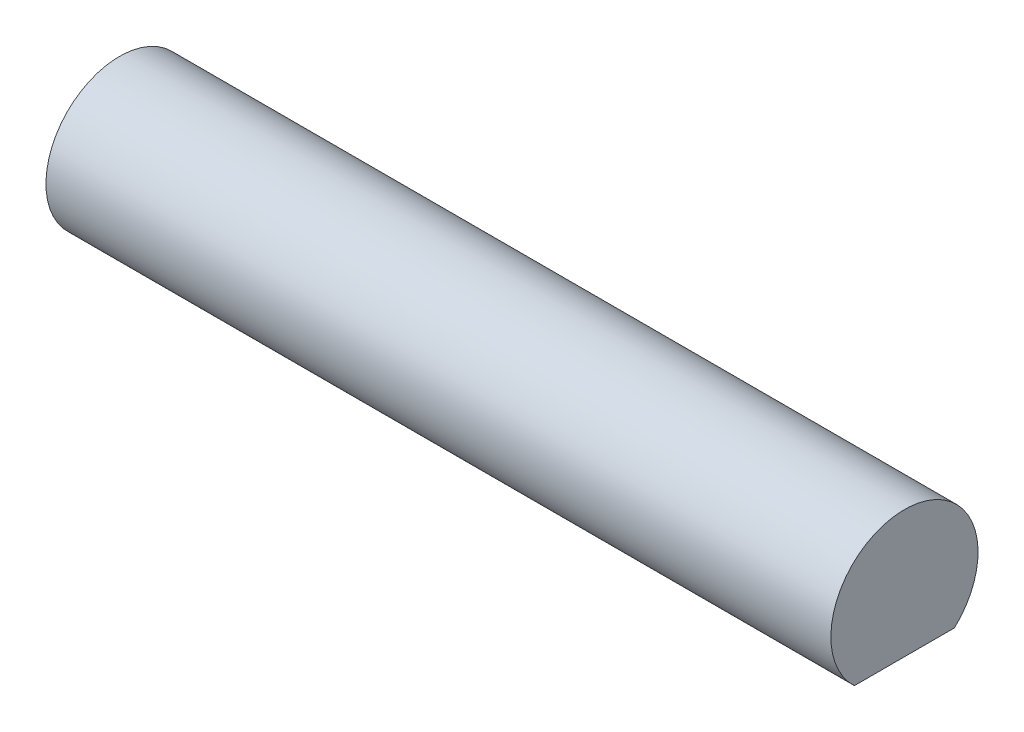
ISO-10303-21;
HEADER;
FILE_DESCRIPTION(('STEP AP214'),'2;1');
FILE_NAME('part.step','',(''),(''),'','','');
FILE_SCHEMA(('AUTOMOTIVE_DESIGN { 1 0 10303 214 1 1 1 1 }'));
ENDSEC;
DATA;
#1=APPLICATION_CONTEXT('core data for automotive mechanical design processes');
#2=APPLICATION_PROTOCOL_DEFINITION('international standard','automotive_design',2000,#1);
#3=PRODUCT_CONTEXT('',#1,'mechanical');
#4=PRODUCT('Part','Part','',(#3));
#5=PRODUCT_RELATED_PRODUCT_CATEGORY('part','',(#4));
#6=PRODUCT_DEFINITION_FORMATION('','',#4);
#7=PRODUCT_DEFINITION_CONTEXT('part definition',#1,'design');
#8=PRODUCT_DEFINITION('design','',#6,#7);
#9=PRODUCT_DEFINITION_SHAPE('','',#8);
#10=(LENGTH_UNIT() NAMED_UNIT(*) SI_UNIT(.MILLI.,.METRE.));
#11=(NAMED_UNIT(*) PLANE_ANGLE_UNIT() SI_UNIT($,.RADIAN.));
#12=(NAMED_UNIT(*) SI_UNIT($,.STERADIAN.) SOLID_ANGLE_UNIT());
#13=UNCERTAINTY_MEASURE_WITH_UNIT(LENGTH_MEASURE(1.E-05),#10,'distance_accuracy_value','');
#14=(GEOMETRIC_REPRESENTATION_CONTEXT(3) GLOBAL_UNCERTAINTY_ASSIGNED_CONTEXT((#13)) GLOBAL_UNIT_ASSIGNED_CONTEXT((#10,
#11,#12)) REPRESENTATION_CONTEXT('',''));
#15=CARTESIAN_POINT('',(0.,0.,0.));
#16=DIRECTION('',(0.,0.,1.));
#17=DIRECTION('',(1.,0.,0.));
#18=AXIS2_PLACEMENT_3D('',#15,#16,#17);
#19=CARTESIAN_POINT('',(8.,-1.1,0.));
#20=DIRECTION('',(0.,-1.,0.));
#21=DIRECTION('',(0.,0.,-1.));
#22=AXIS2_PLACEMENT_3D('',#19,#20,#21);
#23=PLANE('',#22);
#24=DIRECTION('',(0.,0.,1.));
#25=VECTOR('',#24,1.);
#26=CARTESIAN_POINT('',(-8.,-1.1,0.));
#27=LINE('',#26,#25);
#28=CARTESIAN_POINT('',(-8.,-1.1,-1.01980390271856));
#29=VERTEX_POINT('',#28);
#30=CARTESIAN_POINT('',(-8.,-1.1,1.01980390271856));
#31=VERTEX_POINT('',#30);
#32=EDGE_CURVE('E63',#29,#31,#27,.T.);
#33=ORIENTED_EDGE('',*,*,#32,.F.);
#34=DIRECTION('',(-1.,0.,0.));
#35=VECTOR('',#34,1.);
#36=CARTESIAN_POINT('',(8.,-1.1,-1.01980390271856));
#37=LINE('',#36,#35);
#38=CARTESIAN_POINT('',(8.,-1.1,-1.01980390271856));
#39=VERTEX_POINT('',#38);
#40=EDGE_CURVE('E11',#39,#29,#37,.T.);
#41=ORIENTED_EDGE('',*,*,#40,.F.);
#42=DIRECTION('',(0.,0.,1.));
#43=VECTOR('',#42,1.);
#44=CARTESIAN_POINT('',(8.,-1.1,0.));
#45=LINE('',#44,#43);
#46=CARTESIAN_POINT('',(8.,-1.1,1.01980390271856));
#47=VERTEX_POINT('',#46);
#48=EDGE_CURVE('E64',#39,#47,#45,.T.);
#49=ORIENTED_EDGE('',*,*,#48,.T.);
#50=DIRECTION('',(-1.,0.,0.));
#51=VECTOR('',#50,1.);
#52=CARTESIAN_POINT('',(8.,-1.1,1.01980390271856));
#53=LINE('',#52,#51);
#54=EDGE_CURVE('E43',#47,#31,#53,.T.);
#55=ORIENTED_EDGE('',*,*,#54,.T.);
#56=EDGE_LOOP('',(#33,#41,#49,#55));
#57=FACE_BOUND('',#56,.T.);
#58=ADVANCED_FACE('F35',(#57),#23,.T.);
#59=CARTESIAN_POINT('',(8.,0.,0.));
#60=DIRECTION('',(-1.,0.,0.));
#61=DIRECTION('',(0.,0.,1.));
#62=AXIS2_PLACEMENT_3D('',#59,#60,#61);
#63=CYLINDRICAL_SURFACE('',#62,1.5);
#64=CARTESIAN_POINT('',(-8.,0.,0.));
#65=DIRECTION('',(1.,0.,0.));
#66=DIRECTION('',(0.,0.,-1.));
#67=AXIS2_PLACEMENT_3D('',#64,#65,#66);
#68=CIRCLE('',#67,1.5);
#69=EDGE_CURVE('E65',#29,#31,#68,.T.);
#70=ORIENTED_EDGE('',*,*,#69,.T.);
#71=ORIENTED_EDGE('',*,*,#54,.F.);
#72=CARTESIAN_POINT('',(8.,0.,0.));
#73=DIRECTION('',(1.,0.,0.));
#74=DIRECTION('',(0.,0.,-1.));
#75=AXIS2_PLACEMENT_3D('',#72,#73,#74);
#76=CIRCLE('',#75,1.5);
#77=EDGE_CURVE('E50',#39,#47,#76,.T.);
#78=ORIENTED_EDGE('',*,*,#77,.F.);
#79=ORIENTED_EDGE('',*,*,#40,.T.);
#80=EDGE_LOOP('',(#70,#71,#78,#79));
#81=FACE_BOUND('',#80,.T.);
#82=ADVANCED_FACE('F66',(#81),#63,.T.);
#83=CARTESIAN_POINT('',(8.,0.,0.));
#84=DIRECTION('',(1.,0.,0.));
#85=DIRECTION('',(0.,0.,-1.));
#86=AXIS2_PLACEMENT_3D('',#83,#84,#85);
#87=PLANE('',#86);
#88=ORIENTED_EDGE('',*,*,#48,.F.);
#89=ORIENTED_EDGE('',*,*,#77,.T.);
#90=EDGE_LOOP('',(#88,#89));
#91=FACE_BOUND('',#90,.T.);
#92=ADVANCED_FACE('F74',(#91),#87,.T.);
#93=CARTESIAN_POINT('',(-8.,0.,0.));
#94=DIRECTION('',(1.,0.,0.));
#95=DIRECTION('',(0.,0.,-1.));
#96=AXIS2_PLACEMENT_3D('',#93,#94,#95);
#97=PLANE('',#96);
#98=ORIENTED_EDGE('',*,*,#32,.T.);
#99=ORIENTED_EDGE('',*,*,#69,.F.);
#100=EDGE_LOOP('',(#98,#99));
#101=FACE_BOUND('',#100,.T.);
#102=ADVANCED_FACE('F69',(#101),#97,.F.);
#103=CLOSED_SHELL('',(#58,#82,#92,#102));
#104=MANIFOLD_SOLID_BREP('B2',#103);
#105=ADVANCED_BREP_SHAPE_REPRESENTATION('',(#18,#104),#14);
#106=SHAPE_DEFINITION_REPRESENTATION(#9,#105);
ENDSEC;
END-ISO-10303-21;
